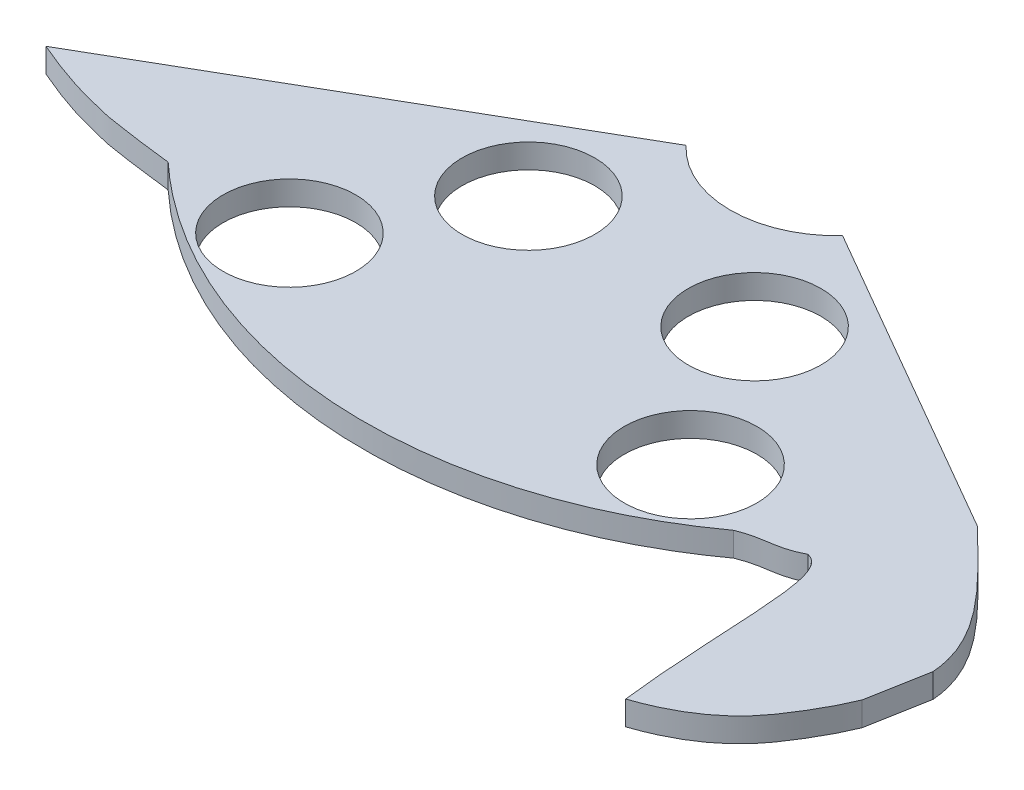
ISO-10303-21;
HEADER;
FILE_DESCRIPTION(('STEP AP214'),'2;1');
FILE_NAME('part.step','',(''),(''),'','','');
FILE_SCHEMA(('AUTOMOTIVE_DESIGN { 1 0 10303 214 1 1 1 1 }'));
ENDSEC;
DATA;
#1=APPLICATION_CONTEXT('core data for automotive mechanical design processes');
#2=APPLICATION_PROTOCOL_DEFINITION('international standard','automotive_design',2000,#1);
#3=PRODUCT_CONTEXT('',#1,'mechanical');
#4=PRODUCT('Part','Part','',(#3));
#5=PRODUCT_RELATED_PRODUCT_CATEGORY('part','',(#4));
#6=PRODUCT_DEFINITION_FORMATION('','',#4);
#7=PRODUCT_DEFINITION_CONTEXT('part definition',#1,'design');
#8=PRODUCT_DEFINITION('design','',#6,#7);
#9=PRODUCT_DEFINITION_SHAPE('','',#8);
#10=(LENGTH_UNIT() NAMED_UNIT(*) SI_UNIT(.MILLI.,.METRE.));
#11=(NAMED_UNIT(*) PLANE_ANGLE_UNIT() SI_UNIT($,.RADIAN.));
#12=(NAMED_UNIT(*) SI_UNIT($,.STERADIAN.) SOLID_ANGLE_UNIT());
#13=UNCERTAINTY_MEASURE_WITH_UNIT(LENGTH_MEASURE(1.E-05),#10,'distance_accuracy_value','');
#14=(GEOMETRIC_REPRESENTATION_CONTEXT(3) GLOBAL_UNCERTAINTY_ASSIGNED_CONTEXT((#13)) GLOBAL_UNIT_ASSIGNED_CONTEXT((#10,
#11,#12)) REPRESENTATION_CONTEXT('',''));
#15=CARTESIAN_POINT('',(0.,0.,0.));
#16=DIRECTION('',(0.,0.,1.));
#17=DIRECTION('',(1.,0.,0.));
#18=AXIS2_PLACEMENT_3D('',#15,#16,#17);
#19=CARTESIAN_POINT('',(-67.1542123865947,-31.7359999999999,55.3592407251619));
#20=DIRECTION('',(0.,-1.,0.));
#21=DIRECTION('',(0.,0.,-1.));
#22=AXIS2_PLACEMENT_3D('',#19,#20,#21);
#23=PLANE('',#22);
#24=CARTESIAN_POINT('',(18.75,-31.7359999999999,32.476));
#25=DIRECTION('',(0.,-1.,0.));
#26=DIRECTION('',(0.,0.,-1.));
#27=AXIS2_PLACEMENT_3D('',#24,#25,#26);
#28=CIRCLE('',#27,10.999845998306);
#29=CARTESIAN_POINT('',(18.75,-31.7359999999999,21.476154001694));
#30=VERTEX_POINT('',#29);
#31=EDGE_CURVE('E388',#30,#30,#28,.T.);
#32=ORIENTED_EDGE('',*,*,#31,.F.);
#33=EDGE_LOOP('',(#32));
#34=FACE_BOUND('',#33,.T.);
#35=CARTESIAN_POINT('',(-33.25,-31.7359999999999,57.591));
#36=DIRECTION('',(0.,-1.,0.));
#37=DIRECTION('',(0.,0.,-1.));
#38=AXIS2_PLACEMENT_3D('',#35,#36,#37);
#39=CIRCLE('',#38,10.999845998306);
#40=CARTESIAN_POINT('',(-33.25,-31.7359999999999,46.591154001694));
#41=VERTEX_POINT('',#40);
#42=EDGE_CURVE('E381',#41,#41,#39,.T.);
#43=ORIENTED_EDGE('',*,*,#42,.F.);
#44=EDGE_LOOP('',(#43));
#45=FACE_BOUND('',#44,.T.);
#46=DIRECTION('',(0.8660251781737,0.,-0.500000390769058));
#47=VECTOR('',#46,1.);
#48=CARTESIAN_POINT('',(-69.4472981971247,-31.7359999999999,44.7142726813082));
#49=LINE('',#48,#47);
#50=CARTESIAN_POINT('',(-80.2457627718106,-31.7359999999999,50.9487756070024));
#51=VERTEX_POINT('',#50);
#52=CARTESIAN_POINT('',(-69.4472981971247,-31.7359999999999,44.7142726813082));
#53=VERTEX_POINT('',#52);
#54=EDGE_CURVE('E375',#51,#53,#49,.T.);
#55=ORIENTED_EDGE('',*,*,#54,.T.);
#56=DIRECTION('',(0.866025120737022,0.,-0.500000490252186));
#57=VECTOR('',#56,1.);
#58=CARTESIAN_POINT('',(-69.4472981971247,-31.7359999999999,44.7142726813082));
#59=LINE('',#58,#57);
#60=CARTESIAN_POINT('',(-12.9766531358799,-31.7359999999999,12.1108879302399));
#61=VERTEX_POINT('',#60);
#62=EDGE_CURVE('E107',#53,#61,#59,.T.);
#63=ORIENTED_EDGE('',*,*,#62,.T.);
#64=CARTESIAN_POINT('',(0.,-31.7359999999999,0.));
#65=DIRECTION('',(0.,1.,0.));
#66=DIRECTION('',(0.,0.,-1.));
#67=AXIS2_PLACEMENT_3D('',#64,#65,#66);
#68=CIRCLE('',#67,17.7501305084715);
#69=CARTESIAN_POINT('',(12.9766531358511,-31.7359999999999,12.1108879302707));
#70=VERTEX_POINT('',#69);
#71=EDGE_CURVE('E374',#61,#70,#68,.T.);
#72=ORIENTED_EDGE('',*,*,#71,.T.);
#73=DIRECTION('',(0.866025113442762,0.,0.500000502886197));
#74=VECTOR('',#73,1.);
#75=CARTESIAN_POINT('',(12.9766531358511,-31.7359999999999,12.1108879302707));
#76=LINE('',#75,#74);
#77=CARTESIAN_POINT('',(65.8946490574716,-31.7359999999999,42.6631480920527));
#78=VERTEX_POINT('',#77);
#79=EDGE_CURVE('E336',#70,#78,#76,.T.);
#80=ORIENTED_EDGE('',*,*,#79,.T.);
#81=CARTESIAN_POINT('',(65.8946490574716,-31.7359999999999,42.6631480920527));
#82=CARTESIAN_POINT('',(75.4145416015002,-31.7359999999999,51.940049241931));
#83=CARTESIAN_POINT('',(82.3765856825695,-31.7359999999999,58.6162565448879));
#84=CARTESIAN_POINT('',(83.0502389135735,-31.7359999999999,67.164443807956));
#85=B_SPLINE_CURVE_WITH_KNOTS('',3,(#81,#82,#83,#84),.UNSPECIFIED.,.F.,.F.,(4,4),(0.,1.),.UNSPECIFIED.);
#86=CARTESIAN_POINT('',(83.0502389135735,-31.7359999999999,67.164443807956));
#87=VERTEX_POINT('',#86);
#88=EDGE_CURVE('E331',#78,#87,#85,.T.);
#89=ORIENTED_EDGE('',*,*,#88,.T.);
#90=DIRECTION('',(-0.178791975324779,0.,0.983886898764011));
#91=VECTOR('',#90,1.);
#92=CARTESIAN_POINT('',(83.0502389135735,-31.7359999999999,67.164443807956));
#93=LINE('',#92,#91);
#94=CARTESIAN_POINT('',(81.2370523152279,-31.7359999999999,77.1423554893168));
#95=VERTEX_POINT('',#94);
#96=EDGE_CURVE('E325',#87,#95,#93,.T.);
#97=ORIENTED_EDGE('',*,*,#96,.T.);
#98=CARTESIAN_POINT('',(81.2370523152279,-31.7359999999999,77.1423554893168));
#99=CARTESIAN_POINT('',(80.1426049600917,-31.7359999999999,79.8324304502769));
#100=CARTESIAN_POINT('',(78.5423570735947,-31.7359999999999,82.75217887059));
#101=CARTESIAN_POINT('',(72.9003380692606,-31.7359999999999,91.1400641734414));
#102=CARTESIAN_POINT('',(67.8354049075009,-31.7359999999999,94.4711963023661));
#103=CARTESIAN_POINT('',(61.5133899629736,-31.7359999999999,96.6041758783421));
#104=B_SPLINE_CURVE_WITH_KNOTS('',3,(#98,#99,#100,#101,#102,#103),.UNSPECIFIED.,.F.,.F.,(4,2,4),
(0.,0.384612078312348,0.999999759150881),.UNSPECIFIED.);
#105=CARTESIAN_POINT('',(61.5133899629736,-31.7359999999999,96.6041758783421));
#106=VERTEX_POINT('',#105);
#107=EDGE_CURVE('E300',#95,#106,#104,.T.);
#108=ORIENTED_EDGE('',*,*,#107,.T.);
#109=CARTESIAN_POINT('',(55.8371220766772,-31.7359999999999,60.7330896766971));
#110=CARTESIAN_POINT('',(55.9572182160026,-31.7359999999999,60.7648800494554));
#111=CARTESIAN_POINT('',(56.1943017513894,-31.7359999999999,60.8276321635437));
#112=CARTESIAN_POINT('',(56.5293050502606,-31.7359999999999,60.9764066754173));
#113=CARTESIAN_POINT('',(56.9147693621887,-31.7359999999999,61.2091894316015));
#114=CARTESIAN_POINT('',(57.3335774009859,-31.7359999999999,61.580320396772));
#115=CARTESIAN_POINT('',(57.7236265230981,-31.7359999999999,62.0925569273689));
#116=CARTESIAN_POINT('',(58.0469966018681,-31.7359999999999,62.6702768912015));
#117=CARTESIAN_POINT('',(58.3786369666738,-31.7359999999999,63.4379128847456));
#118=CARTESIAN_POINT('',(58.7065880437535,-31.7359999999999,64.4888894393945));
#119=CARTESIAN_POINT('',(58.9826843241353,-31.7359999999999,65.7379688878289));
#120=CARTESIAN_POINT('',(59.2021878443187,-31.7359999999999,67.0584993113356));
#121=CARTESIAN_POINT('',(59.4270079702606,-31.7359999999999,68.7827708547501));
#122=CARTESIAN_POINT('',(59.6334535892654,-31.7359999999999,70.9740502496213));
#123=CARTESIAN_POINT('',(59.8186124996113,-31.7359999999999,73.5770282216461));
#124=CARTESIAN_POINT('',(59.9731515281198,-31.7359999999999,76.1821796531466));
#125=CARTESIAN_POINT('',(60.1153992829083,-31.7359999999999,78.7881932546546));
#126=CARTESIAN_POINT('',(60.2576831241111,-31.7359999999999,81.3942346470838));
#127=CARTESIAN_POINT('',(60.4093902156785,-31.7359999999999,83.9996284084462));
#128=CARTESIAN_POINT('',(60.5783374993919,-31.7359999999999,86.6038073783577));
#129=CARTESIAN_POINT('',(60.7399818017884,-31.7359999999999,88.7778336367267));
#130=CARTESIAN_POINT('',(60.8846203081433,-31.7359999999999,90.5115337254225));
#131=CARTESIAN_POINT('',(60.9993907859476,-31.7359999999999,91.7903134549724));
#132=CARTESIAN_POINT('',(61.1192473828836,-31.7359999999999,93.0344520814384));
#133=CARTESIAN_POINT('',(61.244364540668,-31.7359999999999,94.2465798515415));
#134=CARTESIAN_POINT('',(61.3744804408622,-31.7359999999999,95.4340560329306));
#135=CARTESIAN_POINT('',(61.4674156600067,-31.7359999999999,96.2168626921242));
#136=CARTESIAN_POINT('',(61.5133975758836,-31.7359999999999,96.6041749745334));
#137=B_SPLINE_CURVE_WITH_KNOTS('',3,(#109,#110,#111,#112,#113,#114,#115,#116,#117,#118,#119,
#120,#121,#122,#123,#124,#125,#126,#127,#128,#129,#130,#131,#132,#133,#134,#135,#136),
.UNSPECIFIED.,.F.,.F.,(4,1,1,1,1,1,1,1,1,1,1,1,1,1,1,1,1,1,1,1,1,1,1,1,1,4),
(-4.32909310621454E-08,0.00999701545049358,0.0197351504627304,0.0294121944947161,
0.0461972685733814,0.0644513125890503,0.0810361385479351,0.0994350802182177,0.1317352470654,
0.169566844260307,0.202432758389494,0.239570155145605,0.309653847868401,0.379737117055157,
0.449830301367976,0.519929632423882,0.590029203337477,0.660124360472665,0.730213586731021,
0.800299621413169,0.83577595454087,0.870390717459047,0.903750589583447,0.936485572304299,
0.968576135196696,1.00000279982156),.UNSPECIFIED.);
#138=CARTESIAN_POINT('',(55.8371220766773,-31.7359999999999,60.7330896766971));
#139=VERTEX_POINT('',#138);
#140=EDGE_CURVE('E137',#106,#139,#137,.F.);
#141=ORIENTED_EDGE('',*,*,#140,.T.);
#142=CARTESIAN_POINT('',(46.2452118619303,-31.7359999999999,63.4316054794592));
#143=CARTESIAN_POINT('',(46.337826451566,-31.7359999999999,63.3951630130936));
#144=CARTESIAN_POINT('',(46.5107173798544,-31.7359999999999,63.3271329989904));
#145=CARTESIAN_POINT('',(46.8827590320524,-31.7359999999999,63.1876460598679));
#146=CARTESIAN_POINT('',(47.562852890933,-31.7359999999999,62.9506252183054));
#147=CARTESIAN_POINT('',(48.5799881653781,-31.7359999999999,62.6579392012386));
#148=CARTESIAN_POINT('',(49.6176269931826,-31.7359999999999,62.4469394700371));
#149=CARTESIAN_POINT('',(50.454675197474,-31.7359999999999,62.3104712330071));
#150=CARTESIAN_POINT('',(51.2943251992915,-31.7359999999999,62.1825648854283));
#151=CARTESIAN_POINT('',(52.3424577820839,-31.7359999999999,62.010683702123));
#152=CARTESIAN_POINT('',(53.5785540224912,-31.7359999999999,61.7028566985066));
#153=CARTESIAN_POINT('',(54.5743792876471,-31.7359999999999,61.3376946020341));
#154=CARTESIAN_POINT('',(55.231073633369,-31.7359999999999,61.0393961064838));
#155=CARTESIAN_POINT('',(55.5865600511412,-31.7359999999999,60.8639856570596));
#156=CARTESIAN_POINT('',(55.7504956465041,-31.7359999999999,60.7783451619097));
#157=CARTESIAN_POINT('',(55.8371220766232,-31.7359999999999,60.7330896765936));
#158=B_SPLINE_CURVE_WITH_KNOTS('',3,(#142,#143,#144,#145,#146,#147,#148,#149,#150,#151,#152,
#153,#154,#155,#156,#157),.UNSPECIFIED.,.F.,.F.,(4,1,1,1,1,1,1,1,1,1,1,1,1,4),
(3.39488733238635E-05,0.0298680043739559,0.0557275233998022,0.119134844750029,0.245729863665602,
0.372639773706773,0.436291383372757,0.499957120025951,0.627252648589094,0.754554880733438,
0.881180220072594,0.944558052759256,0.970703295687976,1.),.UNSPECIFIED.);
#159=CARTESIAN_POINT('',(46.2452118619303,-31.7359999999999,63.4316054794592));
#160=VERTEX_POINT('',#159);
#161=EDGE_CURVE('E129',#139,#160,#158,.F.);
#162=ORIENTED_EDGE('',*,*,#161,.T.);
#163=CARTESIAN_POINT('',(-53.4893401412044,-31.7359999999999,57.4553575450886));
#164=CARTESIAN_POINT('',(-50.1865786234929,-31.7359999999999,60.530633694826));
#165=CARTESIAN_POINT('',(-46.618572045229,-31.7359999999999,63.3191161806949));
#166=CARTESIAN_POINT('',(-39.0551084352809,-31.7359999999999,68.2446238295473));
#167=CARTESIAN_POINT('',(-35.0622169623532,-31.7359999999999,70.3790891958994));
#168=CARTESIAN_POINT('',(-26.763939823196,-31.7359999999999,73.9343458847786));
#169=CARTESIAN_POINT('',(-22.464450628197,-31.7359999999999,75.3523038004715));
#170=CARTESIAN_POINT('',(-13.6808684002517,-31.7359999999999,77.4297187386164));
#171=CARTESIAN_POINT('',(-9.20042271711571,-31.7359999999999,78.0890818901254));
#172=CARTESIAN_POINT('',(-0.190679327055086,-31.7359999999999,78.6285088587536));
#173=CARTESIAN_POINT('',(4.3369860359544,-31.7359999999999,78.5100669761452));
#174=CARTESIAN_POINT('',(13.3043442517594,-31.7359999999999,77.4954119685198));
#175=CARTESIAN_POINT('',(17.7449792987534,-31.7359999999999,76.6011212963634));
#176=CARTESIAN_POINT('',(26.4064634267764,-31.7359999999999,74.0631253553625));
#177=CARTESIAN_POINT('',(30.6270131277086,-31.7359999999999,72.4210723936952));
#178=CARTESIAN_POINT('',(36.6980942739425,-31.7359999999999,69.4299810562971));
#179=CARTESIAN_POINT('',(38.6809192993778,-31.7359999999999,68.3446979598656));
#180=CARTESIAN_POINT('',(42.543443096176,-31.7359999999999,66.010786965088));
#181=CARTESIAN_POINT('',(44.422079014527,-31.7359999999999,64.7613382842975));
#182=CARTESIAN_POINT('',(46.2452118618439,-31.7359999999999,63.4316054793408));
#183=B_SPLINE_CURVE_WITH_KNOTS('',3,(#163,#164,#165,#166,#167,#168,#169,#170,#171,#172,#173,
#174,#175,#176,#177,#178,#179,#180,#181,#182),.UNSPECIFIED.,.F.,.F.,(4,2,2,2,2,2,2,2,2,4),
(1.74061715230156E-06,0.125000987959647,0.250000987959647,0.375000987959647,0.500000987959647,
0.625000987959647,0.750000987959647,0.875000987959647,0.937500987959647,0.999999247342494),.UNSPECIFIED.);
#184=CARTESIAN_POINT('',(-53.4893401412041,-31.7359999999999,57.4553575450889));
#185=VERTEX_POINT('',#184);
#186=EDGE_CURVE('E134',#160,#185,#183,.F.);
#187=ORIENTED_EDGE('',*,*,#186,.T.);
#188=CARTESIAN_POINT('',(-80.2457627718106,-31.7359999999999,50.9487756070024));
#189=CARTESIAN_POINT('',(-79.9710240449724,-31.7359999999999,51.0675176149174));
#190=CARTESIAN_POINT('',(-79.4163281074057,-31.7359999999999,51.3072570581586));
#191=CARTESIAN_POINT('',(-78.2013274676912,-31.7359999999999,51.8157264794908));
#192=CARTESIAN_POINT('',(-76.424640425333,-31.7359999999999,52.5270811036941));
#193=CARTESIAN_POINT('',(-74.164307694632,-31.7359999999999,53.363768474054));
#194=CARTESIAN_POINT('',(-72.1397013701143,-31.7359999999999,54.0344762002689));
#195=CARTESIAN_POINT('',(-70.6019761674887,-31.7359999999999,54.4815865255904));
#196=CARTESIAN_POINT('',(-69.4414572478317,-31.7359999999999,54.7873275160044));
#197=CARTESIAN_POINT('',(-68.3106352193613,-31.7359999999999,55.0670554545509));
#198=CARTESIAN_POINT('',(-67.3407336861109,-31.7359999999999,55.3106235754107));
#199=CARTESIAN_POINT('',(-66.5661235840869,-31.7359999999999,55.5105766290934));
#200=CARTESIAN_POINT('',(-65.9849002576492,-31.7359999999999,55.6598360584587));
#201=CARTESIAN_POINT('',(-65.4001768571308,-31.7359999999999,55.7976384683275));
#202=CARTESIAN_POINT('',(-64.8087805357869,-31.7359999999999,55.9091609300685));
#203=CARTESIAN_POINT('',(-64.2132773856928,-31.7359999999999,56.0026572003222));
#204=CARTESIAN_POINT('',(-63.417418240987,-31.7359999999999,56.1216288809392));
#205=CARTESIAN_POINT('',(-62.4227200921819,-31.7359999999999,56.2721850298928));
#206=CARTESIAN_POINT('',(-61.2297291551601,-31.7359999999999,56.4577985633297));
#207=CARTESIAN_POINT('',(-60.0351186775312,-31.7359999999999,56.6371572699833));
#208=CARTESIAN_POINT('',(-58.8371149091859,-31.7359999999999,56.8027287863694));
#209=CARTESIAN_POINT('',(-57.6355479253561,-31.7359999999999,56.9523600335831));
#210=CARTESIAN_POINT('',(-56.4322694436166,-31.7359999999999,57.0957628206297));
#211=CARTESIAN_POINT('',(-55.3156468785094,-31.7359999999999,57.2289038536631));
#212=CARTESIAN_POINT('',(-54.3346428117277,-31.7359999999999,57.3486366881149));
#213=CARTESIAN_POINT('',(-53.7550150032177,-31.7359999999999,57.421815655374));
#214=CARTESIAN_POINT('',(-53.4893401412043,-31.7359999999999,57.455357545089));
#215=B_SPLINE_CURVE_WITH_KNOTS('',3,(#188,#189,#190,#191,#192,#193,#194,#195,#196,#197,#198,
#199,#200,#201,#202,#203,#204,#205,#206,#207,#208,#209,#210,#211,#212,#213,#214),.UNSPECIFIED.,
.F.,.F.,(4,1,1,1,1,1,1,1,1,1,1,1,1,1,1,1,1,1,1,1,1,1,1,1,4),(0.,0.0324496499891075,
0.0655156600293397,0.142796548847021,0.239924982281343,0.326787352355294,0.373965278379878,
0.413525211675801,0.456894269351231,0.500262539435267,0.52194540448629,0.543629130729834,
0.565323701920074,0.587063048052444,0.608858021916453,0.630675937975899,0.67430843436511,
0.717929982537018,0.761574952728187,0.805276979087721,0.849046649735792,0.892851591200768,
0.936658553136211,0.970967179441354,1.),.UNSPECIFIED.);
#216=EDGE_CURVE('E51',#185,#51,#215,.F.);
#217=ORIENTED_EDGE('',*,*,#216,.T.);
#218=EDGE_LOOP('',(#55,#63,#72,#80,#89,#97,#108,#141,#162,#187,#217));
#219=FACE_BOUND('',#218,.T.);
#220=CARTESIAN_POINT('',(33.25,-31.7359999999999,57.591));
#221=DIRECTION('',(0.,-1.,0.));
#222=DIRECTION('',(0.,0.,-1.));
#223=AXIS2_PLACEMENT_3D('',#220,#221,#222);
#224=CIRCLE('',#223,10.999845998306);
#225=CARTESIAN_POINT('',(33.25,-31.7359999999999,46.591154001694));
#226=VERTEX_POINT('',#225);
#227=EDGE_CURVE('E382',#226,#226,#224,.T.);
#228=ORIENTED_EDGE('',*,*,#227,.F.);
#229=EDGE_LOOP('',(#228));
#230=FACE_BOUND('',#229,.T.);
#231=CARTESIAN_POINT('',(-18.75,-31.7359999999999,32.476));
#232=DIRECTION('',(0.,-1.,0.));
#233=DIRECTION('',(0.,0.,-1.));
#234=AXIS2_PLACEMENT_3D('',#231,#232,#233);
#235=CIRCLE('',#234,10.999845998306);
#236=CARTESIAN_POINT('',(-18.75,-31.7359999999999,21.476154001694));
#237=VERTEX_POINT('',#236);
#238=EDGE_CURVE('E394',#237,#237,#235,.T.);
#239=ORIENTED_EDGE('',*,*,#238,.F.);
#240=EDGE_LOOP('',(#239));
#241=FACE_BOUND('',#240,.T.);
#242=ADVANCED_FACE('F30',(#34,#45,#219,#230,#241),#23,.T.);
#243=CARTESIAN_POINT('',(-67.1542123865947,-27.7359999999999,55.3592407251619));
#244=DIRECTION('',(0.,-1.,0.));
#245=DIRECTION('',(0.,0.,-1.));
#246=AXIS2_PLACEMENT_3D('',#243,#244,#245);
#247=PLANE('',#246);
#248=CARTESIAN_POINT('',(18.75,-27.7359999999999,32.476));
#249=DIRECTION('',(0.,-1.,0.));
#250=DIRECTION('',(0.,0.,-1.));
#251=AXIS2_PLACEMENT_3D('',#248,#249,#250);
#252=CIRCLE('',#251,10.999845998306);
#253=CARTESIAN_POINT('',(18.75,-27.7359999999999,21.476154001694));
#254=VERTEX_POINT('',#253);
#255=EDGE_CURVE('E391',#254,#254,#252,.T.);
#256=ORIENTED_EDGE('',*,*,#255,.T.);
#257=EDGE_LOOP('',(#256));
#258=FACE_BOUND('',#257,.T.);
#259=CARTESIAN_POINT('',(-33.25,-27.7359999999999,57.591));
#260=DIRECTION('',(0.,-1.,0.));
#261=DIRECTION('',(0.,0.,-1.));
#262=AXIS2_PLACEMENT_3D('',#259,#260,#261);
#263=CIRCLE('',#262,10.999845998306);
#264=CARTESIAN_POINT('',(-33.25,-27.7359999999999,46.591154001694));
#265=VERTEX_POINT('',#264);
#266=EDGE_CURVE('E378',#265,#265,#263,.T.);
#267=ORIENTED_EDGE('',*,*,#266,.T.);
#268=EDGE_LOOP('',(#267));
#269=FACE_BOUND('',#268,.T.);
#270=DIRECTION('',(0.8660251781737,0.,-0.500000390769058));
#271=VECTOR('',#270,1.);
#272=CARTESIAN_POINT('',(-69.4472981971247,-27.7359999999999,44.7142726813082));
#273=LINE('',#272,#271);
#274=CARTESIAN_POINT('',(-80.2457627718106,-27.7359999999999,50.9487756070024));
#275=VERTEX_POINT('',#274);
#276=CARTESIAN_POINT('',(-69.4472981971247,-27.7359999999999,44.7142726813082));
#277=VERTEX_POINT('',#276);
#278=EDGE_CURVE('E202',#275,#277,#273,.T.);
#279=ORIENTED_EDGE('',*,*,#278,.F.);
#280=CARTESIAN_POINT('',(-53.4893401412043,-27.7359999999999,57.455357545089));
#281=CARTESIAN_POINT('',(-53.7550150032177,-27.7359999999999,57.421815655374));
#282=CARTESIAN_POINT('',(-54.3346428117277,-27.7359999999999,57.3486366881149));
#283=CARTESIAN_POINT('',(-55.3156468785094,-27.7359999999999,57.2289038536631));
#284=CARTESIAN_POINT('',(-56.4322694436166,-27.7359999999999,57.0957628206297));
#285=CARTESIAN_POINT('',(-57.6355479253561,-27.7359999999999,56.9523600335831));
#286=CARTESIAN_POINT('',(-58.8371149091859,-27.7359999999999,56.8027287863694));
#287=CARTESIAN_POINT('',(-60.0351186775312,-27.7359999999999,56.6371572699833));
#288=CARTESIAN_POINT('',(-61.2297291551601,-27.7359999999999,56.4577985633297));
#289=CARTESIAN_POINT('',(-62.4227200921819,-27.7359999999999,56.2721850298928));
#290=CARTESIAN_POINT('',(-63.417418240987,-27.7359999999999,56.1216288809392));
#291=CARTESIAN_POINT('',(-64.2132773856928,-27.7359999999999,56.0026572003222));
#292=CARTESIAN_POINT('',(-64.8087805357869,-27.7359999999999,55.9091609300685));
#293=CARTESIAN_POINT('',(-65.4001768571308,-27.7359999999999,55.7976384683275));
#294=CARTESIAN_POINT('',(-65.9849002576492,-27.7359999999999,55.6598360584587));
#295=CARTESIAN_POINT('',(-66.5661235840869,-27.7359999999999,55.5105766290934));
#296=CARTESIAN_POINT('',(-67.3407336861109,-27.7359999999999,55.3106235754107));
#297=CARTESIAN_POINT('',(-68.3106352193613,-27.7359999999999,55.0670554545509));
#298=CARTESIAN_POINT('',(-69.4414572478317,-27.7359999999999,54.7873275160044));
#299=CARTESIAN_POINT('',(-70.6019761674887,-27.7359999999999,54.4815865255904));
#300=CARTESIAN_POINT('',(-72.1397013701143,-27.7359999999999,54.0344762002689));
#301=CARTESIAN_POINT('',(-74.164307694632,-27.7359999999999,53.363768474054));
#302=CARTESIAN_POINT('',(-76.424640425333,-27.7359999999999,52.5270811036941));
#303=CARTESIAN_POINT('',(-78.2013274676912,-27.7359999999999,51.8157264794908));
#304=CARTESIAN_POINT('',(-79.4163281074057,-27.7359999999999,51.3072570581586));
#305=CARTESIAN_POINT('',(-79.9710240449724,-27.7359999999999,51.0675176149174));
#306=CARTESIAN_POINT('',(-80.2457627718106,-27.7359999999999,50.9487756070024));
#307=B_SPLINE_CURVE_WITH_KNOTS('',3,(#280,#281,#282,#283,#284,#285,#286,#287,#288,#289,#290,
#291,#292,#293,#294,#295,#296,#297,#298,#299,#300,#301,#302,#303,#304,#305,#306),.UNSPECIFIED.,
.F.,.F.,(4,1,1,1,1,1,1,1,1,1,1,1,1,1,1,1,1,1,1,1,1,1,1,1,4),(0.,0.0290328205586459,
0.063341446863789,0.107148408799232,0.150953350264208,0.194723020912279,0.238425047271813,
0.282070017462982,0.32569156563489,0.369324062024101,0.391141978083548,0.412936951947556,
0.434676298079926,0.456370869270166,0.47805459551371,0.499737460564733,0.543105730648769,
0.586474788324199,0.626034721620122,0.673212647644706,0.760075017718657,0.857203451152979,
0.93448433997066,0.967550350010893,1.),.UNSPECIFIED.);
#308=CARTESIAN_POINT('',(-53.4893401412041,-27.7359999999999,57.4553575450889));
#309=VERTEX_POINT('',#308);
#310=EDGE_CURVE('E97',#309,#275,#307,.T.);
#311=ORIENTED_EDGE('',*,*,#310,.F.);
#312=CARTESIAN_POINT('',(46.2452118618439,-27.7359999999999,63.4316054793408));
#313=CARTESIAN_POINT('',(44.422079014527,-27.7359999999999,64.7613382842975));
#314=CARTESIAN_POINT('',(42.543443096176,-27.7359999999999,66.010786965088));
#315=CARTESIAN_POINT('',(38.6809192993778,-27.7359999999999,68.3446979598656));
#316=CARTESIAN_POINT('',(36.6980942739425,-27.7359999999999,69.4299810562971));
#317=CARTESIAN_POINT('',(30.6270131277086,-27.7359999999999,72.4210723936952));
#318=CARTESIAN_POINT('',(26.4064634267764,-27.7359999999999,74.0631253553625));
#319=CARTESIAN_POINT('',(17.7449792987534,-27.7359999999999,76.6011212963634));
#320=CARTESIAN_POINT('',(13.3043442517594,-27.7359999999999,77.4954119685198));
#321=CARTESIAN_POINT('',(4.3369860359544,-27.7359999999999,78.5100669761452));
#322=CARTESIAN_POINT('',(-0.190679327055086,-27.7359999999999,78.6285088587536));
#323=CARTESIAN_POINT('',(-9.20042271711571,-27.7359999999999,78.0890818901254));
#324=CARTESIAN_POINT('',(-13.6808684002517,-27.7359999999999,77.4297187386164));
#325=CARTESIAN_POINT('',(-22.464450628197,-27.7359999999999,75.3523038004715));
#326=CARTESIAN_POINT('',(-26.763939823196,-27.7359999999999,73.9343458847786));
#327=CARTESIAN_POINT('',(-35.0622169623532,-27.7359999999999,70.3790891958994));
#328=CARTESIAN_POINT('',(-39.0551084352809,-27.7359999999999,68.2446238295473));
#329=CARTESIAN_POINT('',(-46.618572045229,-27.7359999999999,63.3191161806949));
#330=CARTESIAN_POINT('',(-50.1865786234929,-27.7359999999999,60.530633694826));
#331=CARTESIAN_POINT('',(-53.4893401412044,-27.7359999999999,57.4553575450886));
#332=B_SPLINE_CURVE_WITH_KNOTS('',3,(#312,#313,#314,#315,#316,#317,#318,#319,#320,#321,#322,
#323,#324,#325,#326,#327,#328,#329,#330,#331),.UNSPECIFIED.,.F.,.F.,(4,2,2,2,2,2,2,2,2,4),
(1.74061715227199E-06,0.0624999999999999,0.125,0.25,0.375,0.5,0.625,0.75,0.875,
0.999999247342494),.UNSPECIFIED.);
#333=CARTESIAN_POINT('',(46.2452118619303,-27.7359999999999,63.4316054794592));
#334=VERTEX_POINT('',#333);
#335=EDGE_CURVE('E90',#334,#309,#332,.T.);
#336=ORIENTED_EDGE('',*,*,#335,.F.);
#337=CARTESIAN_POINT('',(55.8371220766232,-27.7359999999999,60.7330896765936));
#338=CARTESIAN_POINT('',(55.7504956465041,-27.7359999999999,60.7783451619097));
#339=CARTESIAN_POINT('',(55.5865600511412,-27.7359999999999,60.8639856570596));
#340=CARTESIAN_POINT('',(55.231073633369,-27.7359999999999,61.0393961064838));
#341=CARTESIAN_POINT('',(54.5743792876471,-27.7359999999999,61.3376946020341));
#342=CARTESIAN_POINT('',(53.5785540224912,-27.7359999999999,61.7028566985066));
#343=CARTESIAN_POINT('',(52.3424577820839,-27.7359999999999,62.010683702123));
#344=CARTESIAN_POINT('',(51.2943251992915,-27.7359999999999,62.1825648854283));
#345=CARTESIAN_POINT('',(50.454675197474,-27.7359999999999,62.3104712330071));
#346=CARTESIAN_POINT('',(49.6176269931826,-27.7359999999999,62.4469394700371));
#347=CARTESIAN_POINT('',(48.5799881653781,-27.7359999999999,62.6579392012386));
#348=CARTESIAN_POINT('',(47.562852890933,-27.7359999999999,62.9506252183054));
#349=CARTESIAN_POINT('',(46.8827590320524,-27.7359999999999,63.1876460598679));
#350=CARTESIAN_POINT('',(46.5107173798544,-27.7359999999999,63.3271329989904));
#351=CARTESIAN_POINT('',(46.337826451566,-27.7359999999999,63.3951630130936));
#352=CARTESIAN_POINT('',(46.2452118619303,-27.7359999999999,63.4316054794592));
#353=B_SPLINE_CURVE_WITH_KNOTS('',3,(#337,#338,#339,#340,#341,#342,#343,#344,#345,#346,#347,
#348,#349,#350,#351,#352),.UNSPECIFIED.,.F.,.F.,(4,1,1,1,1,1,1,1,1,1,1,1,1,4),
(3.39488733238026E-05,0.0293306531853482,0.0554758961140681,0.11885372880073,0.245479068139886,
0.37278130028423,0.500076828847373,0.563742565500567,0.627394175166551,0.754304085207722,
0.880899104123295,0.944306425473522,0.970165944499368,1.),.UNSPECIFIED.);
#354=CARTESIAN_POINT('',(55.8371220766773,-27.7359999999999,60.7330896766971));
#355=VERTEX_POINT('',#354);
#356=EDGE_CURVE('E148',#355,#334,#353,.T.);
#357=ORIENTED_EDGE('',*,*,#356,.F.);
#358=CARTESIAN_POINT('',(61.5133975758836,-27.7359999999999,96.6041749745334));
#359=CARTESIAN_POINT('',(61.4674156600067,-27.7359999999999,96.2168626921242));
#360=CARTESIAN_POINT('',(61.3744804408622,-27.7359999999999,95.4340560329306));
#361=CARTESIAN_POINT('',(61.244364540668,-27.7359999999999,94.2465798515415));
#362=CARTESIAN_POINT('',(61.1192473828836,-27.7359999999999,93.0344520814384));
#363=CARTESIAN_POINT('',(60.9993907859476,-27.7359999999999,91.7903134549724));
#364=CARTESIAN_POINT('',(60.8846203081433,-27.7359999999999,90.5115337254225));
#365=CARTESIAN_POINT('',(60.7399818017884,-27.7359999999999,88.7778336367267));
#366=CARTESIAN_POINT('',(60.5783374993919,-27.7359999999999,86.6038073783577));
#367=CARTESIAN_POINT('',(60.4093902156785,-27.7359999999999,83.9996284084462));
#368=CARTESIAN_POINT('',(60.2576831241111,-27.7359999999999,81.3942346470838));
#369=CARTESIAN_POINT('',(60.1153992829083,-27.7359999999999,78.7881932546546));
#370=CARTESIAN_POINT('',(59.9731515281198,-27.7359999999999,76.1821796531466));
#371=CARTESIAN_POINT('',(59.8186124996113,-27.7359999999999,73.5770282216461));
#372=CARTESIAN_POINT('',(59.6334535892654,-27.7359999999999,70.9740502496213));
#373=CARTESIAN_POINT('',(59.4270079702606,-27.7359999999999,68.7827708547501));
#374=CARTESIAN_POINT('',(59.2021878443187,-27.7359999999999,67.0584993113356));
#375=CARTESIAN_POINT('',(58.9826843241353,-27.7359999999999,65.7379688878289));
#376=CARTESIAN_POINT('',(58.7065880437535,-27.7359999999999,64.4888894393945));
#377=CARTESIAN_POINT('',(58.3786369666738,-27.7359999999999,63.4379128847456));
#378=CARTESIAN_POINT('',(58.0469966018681,-27.7359999999999,62.6702768912015));
#379=CARTESIAN_POINT('',(57.7236265230981,-27.7359999999999,62.0925569273689));
#380=CARTESIAN_POINT('',(57.3335774009859,-27.7359999999999,61.580320396772));
#381=CARTESIAN_POINT('',(56.9147693621887,-27.7359999999999,61.2091894316015));
#382=CARTESIAN_POINT('',(56.5293050502606,-27.7359999999999,60.9764066754173));
#383=CARTESIAN_POINT('',(56.1943017513894,-27.7359999999999,60.8276321635437));
#384=CARTESIAN_POINT('',(55.9572182160026,-27.7359999999999,60.7648800494554));
#385=CARTESIAN_POINT('',(55.8371220766772,-27.7359999999999,60.7330896766971));
#386=B_SPLINE_CURVE_WITH_KNOTS('',3,(#358,#359,#360,#361,#362,#363,#364,#365,#366,#367,#368,
#369,#370,#371,#372,#373,#374,#375,#376,#377,#378,#379,#380,#381,#382,#383,#384,#385),
.UNSPECIFIED.,.F.,.F.,(4,1,1,1,1,1,1,1,1,1,1,1,1,1,1,1,1,1,1,1,1,1,1,1,1,4),
(-4.32909309719428E-08,0.0314266213339294,0.063517184226326,0.0962521669471788,
0.129612039071579,0.164226801989756,0.199703135117456,0.269789169799604,0.339878396057961,
0.409973553193149,0.480073124106743,0.55017245516265,0.620265639475468,0.690348908662224,
0.76043260138502,0.797569998141131,0.830435912270318,0.868267509465225,0.900567676312408,
0.91896661798269,0.935551443941575,0.953805487957244,0.970590562035909,0.980267606067895,
0.990005741080132,1.00000279982156),.UNSPECIFIED.);
#387=CARTESIAN_POINT('',(61.5133899629736,-27.7359999999999,96.6041758783421));
#388=VERTEX_POINT('',#387);
#389=EDGE_CURVE('E531',#388,#355,#386,.T.);
#390=ORIENTED_EDGE('',*,*,#389,.F.);
#391=CARTESIAN_POINT('',(81.2370523152279,-27.7359999999999,77.1423554893168));
#392=CARTESIAN_POINT('',(80.1426049600917,-27.7359999999999,79.8324304502769));
#393=CARTESIAN_POINT('',(78.5423570735947,-27.7359999999999,82.75217887059));
#394=CARTESIAN_POINT('',(72.9003380692606,-27.7359999999999,91.1400641734414));
#395=CARTESIAN_POINT('',(67.8354049075009,-27.7359999999999,94.4711963023661));
#396=CARTESIAN_POINT('',(61.5133899629736,-27.7359999999999,96.6041758783421));
#397=B_SPLINE_CURVE_WITH_KNOTS('',3,(#391,#392,#393,#394,#395,#396),.UNSPECIFIED.,.F.,.F.,(4,2,
4),(0.,0.384612078312348,0.999999759150881),.UNSPECIFIED.);
#398=CARTESIAN_POINT('',(81.2370523152279,-27.7359999999999,77.1423554893168));
#399=VERTEX_POINT('',#398);
#400=EDGE_CURVE('E215',#399,#388,#397,.T.);
#401=ORIENTED_EDGE('',*,*,#400,.F.);
#402=DIRECTION('',(-0.178791975324779,0.,0.983886898764011));
#403=VECTOR('',#402,1.);
#404=CARTESIAN_POINT('',(83.0502389135735,-27.7359999999999,67.164443807956));
#405=LINE('',#404,#403);
#406=CARTESIAN_POINT('',(83.0502389135735,-27.7359999999999,67.164443807956));
#407=VERTEX_POINT('',#406);
#408=EDGE_CURVE('E210',#407,#399,#405,.T.);
#409=ORIENTED_EDGE('',*,*,#408,.F.);
#410=CARTESIAN_POINT('',(65.8946490574716,-27.7359999999999,42.6631480920527));
#411=CARTESIAN_POINT('',(75.4145416015002,-27.7359999999999,51.940049241931));
#412=CARTESIAN_POINT('',(82.3765856825695,-27.7359999999999,58.6162565448879));
#413=CARTESIAN_POINT('',(83.0502389135735,-27.7359999999999,67.164443807956));
#414=B_SPLINE_CURVE_WITH_KNOTS('',3,(#410,#411,#412,#413),.UNSPECIFIED.,.F.,.F.,(4,4),(0.,1.),.UNSPECIFIED.);
#415=CARTESIAN_POINT('',(65.8946490574716,-27.7359999999999,42.6631480920527));
#416=VERTEX_POINT('',#415);
#417=EDGE_CURVE('E206',#416,#407,#414,.T.);
#418=ORIENTED_EDGE('',*,*,#417,.F.);
#419=DIRECTION('',(0.866025113442762,0.,0.500000502886197));
#420=VECTOR('',#419,1.);
#421=CARTESIAN_POINT('',(12.9766531358511,-27.7359999999999,12.1108879302707));
#422=LINE('',#421,#420);
#423=CARTESIAN_POINT('',(12.9766531358511,-27.7359999999999,12.1108879302707));
#424=VERTEX_POINT('',#423);
#425=EDGE_CURVE('E204',#424,#416,#422,.T.);
#426=ORIENTED_EDGE('',*,*,#425,.F.);
#427=CARTESIAN_POINT('',(0.,-27.7359999999999,0.));
#428=DIRECTION('',(0.,1.,0.));
#429=DIRECTION('',(0.,0.,-1.));
#430=AXIS2_PLACEMENT_3D('',#427,#428,#429);
#431=CIRCLE('',#430,17.7501305084715);
#432=CARTESIAN_POINT('',(-12.9766531358799,-27.7359999999999,12.1108879302399));
#433=VERTEX_POINT('',#432);
#434=EDGE_CURVE('E201',#433,#424,#431,.T.);
#435=ORIENTED_EDGE('',*,*,#434,.F.);
#436=DIRECTION('',(0.866025120737022,0.,-0.500000490252186));
#437=VECTOR('',#436,1.);
#438=CARTESIAN_POINT('',(-69.4472981971247,-27.7359999999999,44.7142726813082));
#439=LINE('',#438,#437);
#440=EDGE_CURVE('E196',#277,#433,#439,.T.);
#441=ORIENTED_EDGE('',*,*,#440,.F.);
#442=EDGE_LOOP('',(#279,#311,#336,#357,#390,#401,#409,#418,#426,#435,#441));
#443=FACE_BOUND('',#442,.T.);
#444=CARTESIAN_POINT('',(33.25,-27.7359999999999,57.591));
#445=DIRECTION('',(0.,-1.,0.));
#446=DIRECTION('',(0.,0.,-1.));
#447=AXIS2_PLACEMENT_3D('',#444,#445,#446);
#448=CIRCLE('',#447,10.999845998306);
#449=CARTESIAN_POINT('',(33.25,-27.7359999999999,46.591154001694));
#450=VERTEX_POINT('',#449);
#451=EDGE_CURVE('E385',#450,#450,#448,.T.);
#452=ORIENTED_EDGE('',*,*,#451,.T.);
#453=EDGE_LOOP('',(#452));
#454=FACE_BOUND('',#453,.T.);
#455=CARTESIAN_POINT('',(-18.75,-27.7359999999999,32.476));
#456=DIRECTION('',(0.,-1.,0.));
#457=DIRECTION('',(0.,0.,-1.));
#458=AXIS2_PLACEMENT_3D('',#455,#456,#457);
#459=CIRCLE('',#458,10.999845998306);
#460=CARTESIAN_POINT('',(-18.75,-27.7359999999999,21.476154001694));
#461=VERTEX_POINT('',#460);
#462=EDGE_CURVE('E397',#461,#461,#459,.T.);
#463=ORIENTED_EDGE('',*,*,#462,.T.);
#464=EDGE_LOOP('',(#463));
#465=FACE_BOUND('',#464,.T.);
#466=ADVANCED_FACE('F240',(#258,#269,#443,#454,#465),#247,.F.);
#467=CARTESIAN_POINT('',(-69.4472981971247,-31.7359999999999,44.7142726813082));
#468=DIRECTION('',(0.500000490252186,0.,0.866025120737022));
#469=DIRECTION('',(0.866025120737022,0.,-0.500000490252186));
#470=AXIS2_PLACEMENT_3D('',#467,#468,#469);
#471=PLANE('',#470);
#472=ORIENTED_EDGE('',*,*,#440,.T.);
#473=DIRECTION('',(0.,1.,0.));
#474=VECTOR('',#473,1.);
#475=CARTESIAN_POINT('',(-12.9766531358799,-31.7359999999999,12.1108879302399));
#476=LINE('',#475,#474);
#477=EDGE_CURVE('E11',#61,#433,#476,.T.);
#478=ORIENTED_EDGE('',*,*,#477,.F.);
#479=ORIENTED_EDGE('',*,*,#62,.F.);
#480=ORIENTED_EDGE('',*,*,#54,.F.);
#481=DIRECTION('',(0.,1.,0.));
#482=VECTOR('',#481,1.);
#483=CARTESIAN_POINT('',(-80.2457627718106,-31.7359999999999,50.9487756070024));
#484=LINE('',#483,#482);
#485=EDGE_CURVE('E579',#51,#275,#484,.T.);
#486=ORIENTED_EDGE('',*,*,#485,.T.);
#487=ORIENTED_EDGE('',*,*,#278,.T.);
#488=EDGE_LOOP('',(#472,#478,#479,#480,#486,#487));
#489=FACE_BOUND('',#488,.T.);
#490=ADVANCED_FACE('F32',(#489),#471,.F.);
#491=CARTESIAN_POINT('',(0.,-31.7359999999999,0.));
#492=DIRECTION('',(0.,1.,0.));
#493=DIRECTION('',(0.,0.,1.));
#494=AXIS2_PLACEMENT_3D('',#491,#492,#493);
#495=CYLINDRICAL_SURFACE('',#494,17.7501305084715);
#496=ORIENTED_EDGE('',*,*,#434,.T.);
#497=DIRECTION('',(0.,1.,0.));
#498=VECTOR('',#497,1.);
#499=CARTESIAN_POINT('',(12.9766531358511,-31.7359999999999,12.1108879302707));
#500=LINE('',#499,#498);
#501=EDGE_CURVE('E42',#70,#424,#500,.T.);
#502=ORIENTED_EDGE('',*,*,#501,.F.);
#503=ORIENTED_EDGE('',*,*,#71,.F.);
#504=ORIENTED_EDGE('',*,*,#477,.T.);
#505=EDGE_LOOP('',(#496,#502,#503,#504));
#506=FACE_BOUND('',#505,.T.);
#507=ADVANCED_FACE('F349',(#506),#495,.F.);
#508=CARTESIAN_POINT('',(12.9766531358511,-31.7359999999999,12.1108879302707));
#509=DIRECTION('',(-0.500000502886198,0.,0.866025113442763));
#510=DIRECTION('',(0.866025113442762,0.,0.500000502886197));
#511=AXIS2_PLACEMENT_3D('',#508,#509,#510);
#512=PLANE('',#511);
#513=ORIENTED_EDGE('',*,*,#425,.T.);
#514=DIRECTION('',(0.,1.,0.));
#515=VECTOR('',#514,1.);
#516=CARTESIAN_POINT('',(65.8946490574716,-31.7359999999999,42.6631480920527));
#517=LINE('',#516,#515);
#518=EDGE_CURVE('E223',#78,#416,#517,.T.);
#519=ORIENTED_EDGE('',*,*,#518,.F.);
#520=ORIENTED_EDGE('',*,*,#79,.F.);
#521=ORIENTED_EDGE('',*,*,#501,.T.);
#522=EDGE_LOOP('',(#513,#519,#520,#521));
#523=FACE_BOUND('',#522,.T.);
#524=ADVANCED_FACE('F346',(#523),#512,.F.);
#525=DIRECTION('',(0.,1.,0.));
#526=VECTOR('',#525,1.);
#527=SURFACE_OF_LINEAR_EXTRUSION('',#85,#526);
#528=ORIENTED_EDGE('',*,*,#417,.T.);
#529=DIRECTION('',(0.,1.,0.));
#530=VECTOR('',#529,1.);
#531=CARTESIAN_POINT('',(83.0502389135735,-31.7359999999999,67.164443807956));
#532=LINE('',#531,#530);
#533=EDGE_CURVE('E219',#87,#407,#532,.T.);
#534=ORIENTED_EDGE('',*,*,#533,.F.);
#535=ORIENTED_EDGE('',*,*,#88,.F.);
#536=ORIENTED_EDGE('',*,*,#518,.T.);
#537=EDGE_LOOP('',(#528,#534,#535,#536));
#538=FACE_BOUND('',#537,.T.);
#539=ADVANCED_FACE('F342',(#538),#527,.F.);
#540=CARTESIAN_POINT('',(83.0502389135735,-31.7359999999999,67.164443807956));
#541=DIRECTION('',(-0.983886898764011,0.,-0.178791975324779));
#542=DIRECTION('',(-0.178791975324779,0.,0.983886898764011));
#543=AXIS2_PLACEMENT_3D('',#540,#541,#542);
#544=PLANE('',#543);
#545=ORIENTED_EDGE('',*,*,#408,.T.);
#546=DIRECTION('',(0.,1.,0.));
#547=VECTOR('',#546,1.);
#548=CARTESIAN_POINT('',(81.2370523152279,-31.7359999999999,77.1423554893168));
#549=LINE('',#548,#547);
#550=EDGE_CURVE('E216',#95,#399,#549,.T.);
#551=ORIENTED_EDGE('',*,*,#550,.F.);
#552=ORIENTED_EDGE('',*,*,#96,.F.);
#553=ORIENTED_EDGE('',*,*,#533,.T.);
#554=EDGE_LOOP('',(#545,#551,#552,#553));
#555=FACE_BOUND('',#554,.T.);
#556=ADVANCED_FACE('F345',(#555),#544,.F.);
#557=DIRECTION('',(0.,1.,0.));
#558=VECTOR('',#557,1.);
#559=SURFACE_OF_LINEAR_EXTRUSION('',#104,#558);
#560=ORIENTED_EDGE('',*,*,#400,.T.);
#561=DIRECTION('',(0.,1.,0.));
#562=VECTOR('',#561,1.);
#563=CARTESIAN_POINT('',(61.5133899629736,-31.7359999999999,96.6041758783421));
#564=LINE('',#563,#562);
#565=EDGE_CURVE('E220',#106,#388,#564,.T.);
#566=ORIENTED_EDGE('',*,*,#565,.F.);
#567=ORIENTED_EDGE('',*,*,#107,.F.);
#568=ORIENTED_EDGE('',*,*,#550,.T.);
#569=EDGE_LOOP('',(#560,#566,#567,#568));
#570=FACE_BOUND('',#569,.T.);
#571=ADVANCED_FACE('F312',(#570),#559,.F.);
#572=CARTESIAN_POINT('',(-2897.57494149325,-31.7359999999999,578.218210817043));
#573=CARTESIAN_POINT('',(97.3238966732242,-31.7359999999999,186.151132671338));
#574=CARTESIAN_POINT('',(66.4635798230508,-31.7359999999999,141.878681878466));
#575=CARTESIAN_POINT('',(61.244364540668,-31.7359999999999,94.2465798515415));
#576=CARTESIAN_POINT('',(61.1192473828836,-31.7359999999999,93.0344520814384));
#577=CARTESIAN_POINT('',(60.9993907859476,-31.7359999999999,91.7903134549724));
#578=CARTESIAN_POINT('',(60.8846203081433,-31.7359999999999,90.5115337254225));
#579=CARTESIAN_POINT('',(60.7399818017884,-31.7359999999999,88.7778336367267));
#580=CARTESIAN_POINT('',(60.5783374993919,-31.7359999999999,86.6038073783577));
#581=CARTESIAN_POINT('',(60.4093902156785,-31.7359999999999,83.9996284084462));
#582=CARTESIAN_POINT('',(60.2576831241111,-31.7359999999999,81.3942346470838));
#583=CARTESIAN_POINT('',(60.1153992829083,-31.7359999999999,78.7881932546546));
#584=CARTESIAN_POINT('',(59.9731515281198,-31.7359999999999,76.1821796531466));
#585=CARTESIAN_POINT('',(59.8186124996113,-31.7359999999999,73.5770282216461));
#586=CARTESIAN_POINT('',(59.6334535892654,-31.7359999999999,70.9740502496213));
#587=CARTESIAN_POINT('',(59.4270079702606,-31.7359999999999,68.7827708547501));
#588=CARTESIAN_POINT('',(59.2021878443187,-31.7359999999999,67.0584993113356));
#589=CARTESIAN_POINT('',(58.9826843241353,-31.7359999999999,65.7379688878289));
#590=CARTESIAN_POINT('',(58.7065880437535,-31.7359999999999,64.4888894393945));
#591=CARTESIAN_POINT('',(58.3786369666738,-31.7359999999999,63.4379128847456));
#592=CARTESIAN_POINT('',(58.0469966018681,-31.7359999999999,62.6702768912015));
#593=CARTESIAN_POINT('',(57.7236265230981,-31.7359999999999,62.0925569273689));
#594=CARTESIAN_POINT('',(57.3335774009859,-31.7359999999999,61.580320396772));
#595=CARTESIAN_POINT('',(56.9147693621887,-31.7359999999999,61.2091894316015));
#596=CARTESIAN_POINT('',(56.5293050502606,-31.7359999999999,60.9764066754173));
#597=CARTESIAN_POINT('',(48.5773996405681,-31.7359999999999,57.4449762394237));
#598=CARTESIAN_POINT('',(25.765184913745,-31.7359999999999,99.0812547117839));
#599=CARTESIAN_POINT('',(976.857093762419,-31.7359999999999,-2794.08865488927));
#600=B_SPLINE_CURVE_WITH_KNOTS('',3,(#572,#573,#574,#575,#576,#577,#578,#579,#580,#581,#582,
#583,#584,#585,#586,#587,#588,#589,#590,#591,#592,#593,#594,#595,#596,#597,#598,#599),
.UNSPECIFIED.,.F.,.F.,(4,1,1,1,1,1,1,1,1,1,1,1,1,1,1,1,1,1,1,1,1,1,1,1,1,4),(-3.76462114590988,
0.0314266213339294,0.063517184226326,0.0962521669471788,0.129612039071579,0.164226801989756,
0.199703135117456,0.269789169799604,0.339878396057961,0.409973553193149,0.480073124106743,
0.55017245516265,0.620265639475468,0.690348908662224,0.76043260138502,0.797569998141131,
0.830435912270318,0.868267509465225,0.900567676312408,0.91896661798269,0.935551443941575,
0.953805487957244,0.970590562035909,0.980267606067895,0.990005741080132,1.6687428893322),.UNSPECIFIED.);
#601=DIRECTION('',(0.,1.,0.));
#602=VECTOR('',#601,1.);
#603=SURFACE_OF_LINEAR_EXTRUSION('',#600,#602);
#604=ORIENTED_EDGE('',*,*,#389,.T.);
#605=DIRECTION('',(0.,1.,0.));
#606=VECTOR('',#605,1.);
#607=CARTESIAN_POINT('',(55.8371220766773,-31.7359999999999,60.7330896766971));
#608=LINE('',#607,#606);
#609=EDGE_CURVE('E150',#139,#355,#608,.T.);
#610=ORIENTED_EDGE('',*,*,#609,.F.);
#611=ORIENTED_EDGE('',*,*,#140,.F.);
#612=ORIENTED_EDGE('',*,*,#565,.T.);
#613=EDGE_LOOP('',(#604,#610,#611,#612));
#614=FACE_BOUND('',#613,.T.);
#615=ADVANCED_FACE('F303',(#614),#603,.F.);
#616=CARTESIAN_POINT('',(55.8374232234336,-31.7359999999999,60.7329323511053));
#617=CARTESIAN_POINT('',(55.7506964117698,-31.7359999999999,60.778240279672));
#618=CARTESIAN_POINT('',(55.5866616197805,-31.7359999999999,60.8639355392498));
#619=CARTESIAN_POINT('',(55.231073633369,-31.7359999999999,61.0393961064838));
#620=CARTESIAN_POINT('',(54.5743792876471,-31.7359999999999,61.3376946020341));
#621=CARTESIAN_POINT('',(53.5785540224912,-31.7359999999999,61.7028566985066));
#622=CARTESIAN_POINT('',(52.3424577820839,-31.7359999999999,62.010683702123));
#623=CARTESIAN_POINT('',(51.2943251992915,-31.7359999999999,62.1825648854283));
#624=CARTESIAN_POINT('',(50.454675197474,-31.7359999999999,62.3104712330071));
#625=CARTESIAN_POINT('',(49.6176269931826,-31.7359999999999,62.4469394700371));
#626=CARTESIAN_POINT('',(48.5799881653781,-31.7359999999999,62.6579392012386));
#627=CARTESIAN_POINT('',(47.562852890933,-31.7359999999999,62.9506252183054));
#628=CARTESIAN_POINT('',(46.8827590320524,-31.7359999999999,63.1876460598679));
#629=CARTESIAN_POINT('',(46.5107173798544,-31.7359999999999,63.3271329989904));
#630=CARTESIAN_POINT('',(46.337826451566,-31.7359999999999,63.3951630130936));
#631=CARTESIAN_POINT('',(46.2452118619303,-31.7359999999999,63.4316054794592));
#632=B_SPLINE_CURVE_WITH_KNOTS('',3,(#616,#617,#618,#619,#620,#621,#622,#623,#624,#625,#626,
#627,#628,#629,#630,#631),.UNSPECIFIED.,.F.,.F.,(4,1,1,1,1,1,1,1,1,1,1,1,1,4),(0.,
0.0293306531853482,0.0554758961140681,0.11885372880073,0.245479068139886,0.37278130028423,
0.500076828847373,0.563742565500567,0.627394175166551,0.754304085207722,0.880899104123295,
0.944306425473522,0.970165944499368,1.),.UNSPECIFIED.);
#633=DIRECTION('',(0.,1.,0.));
#634=VECTOR('',#633,1.);
#635=SURFACE_OF_LINEAR_EXTRUSION('',#632,#634);
#636=ORIENTED_EDGE('',*,*,#356,.T.);
#637=DIRECTION('',(0.,1.,0.));
#638=VECTOR('',#637,1.);
#639=CARTESIAN_POINT('',(46.2452118619303,-31.7359999999999,63.4316054794592));
#640=LINE('',#639,#638);
#641=EDGE_CURVE('E145',#160,#334,#640,.T.);
#642=ORIENTED_EDGE('',*,*,#641,.F.);
#643=ORIENTED_EDGE('',*,*,#161,.F.);
#644=ORIENTED_EDGE('',*,*,#609,.T.);
#645=EDGE_LOOP('',(#636,#642,#643,#644));
#646=FACE_BOUND('',#645,.T.);
#647=ADVANCED_FACE('F146',(#646),#635,.F.);
#648=CARTESIAN_POINT('',(46.2453641880197,-31.7359999999999,63.4314943773849));
#649=CARTESIAN_POINT('',(44.4221836569494,-31.7359999999999,64.7612686883175));
#650=CARTESIAN_POINT('',(42.5434968823263,-31.7359999999999,66.0107544650714));
#651=CARTESIAN_POINT('',(38.6809192993778,-31.7359999999999,68.3446979598656));
#652=CARTESIAN_POINT('',(36.6980942739425,-31.7359999999999,69.4299810562971));
#653=CARTESIAN_POINT('',(30.6270131277086,-31.7359999999999,72.4210723936952));
#654=CARTESIAN_POINT('',(26.4064634267764,-31.7359999999999,74.0631253553625));
#655=CARTESIAN_POINT('',(17.7449792987534,-31.7359999999999,76.6011212963634));
#656=CARTESIAN_POINT('',(13.3043442517594,-31.7359999999999,77.4954119685198));
#657=CARTESIAN_POINT('',(4.3369860359544,-31.7359999999999,78.5100669761452));
#658=CARTESIAN_POINT('',(-0.190679327055086,-31.7359999999999,78.6285088587536));
#659=CARTESIAN_POINT('',(-9.20042271711571,-31.7359999999999,78.0890818901254));
#660=CARTESIAN_POINT('',(-13.6808684002517,-31.7359999999999,77.4297187386164));
#661=CARTESIAN_POINT('',(-22.464450628197,-31.7359999999999,75.3523038004715));
#662=CARTESIAN_POINT('',(-26.763939823196,-31.7359999999999,73.9343458847786));
#663=CARTESIAN_POINT('',(-35.0622169623532,-31.7359999999999,70.3790891958994));
#664=CARTESIAN_POINT('',(-39.0551084352809,-31.7359999999999,68.2446238295473));
#665=CARTESIAN_POINT('',(-46.6185948160882,-31.7359999999999,63.3191013517691));
#666=CARTESIAN_POINT('',(-50.1866215915348,-31.7359999999999,60.5306001142556));
#667=CARTESIAN_POINT('',(-53.4893998018927,-31.7359999999999,57.4553019936107));
#668=B_SPLINE_CURVE_WITH_KNOTS('',3,(#648,#649,#650,#651,#652,#653,#654,#655,#656,#657,#658,
#659,#660,#661,#662,#663,#664,#665,#666,#667),.UNSPECIFIED.,.F.,.F.,(4,2,2,2,2,2,2,2,2,4),(0.,
0.0624999999999999,0.125,0.25,0.375,0.5,0.625,0.75,0.875,1.),.UNSPECIFIED.);
#669=DIRECTION('',(0.,1.,0.));
#670=VECTOR('',#669,1.);
#671=SURFACE_OF_LINEAR_EXTRUSION('',#668,#670);
#672=ORIENTED_EDGE('',*,*,#335,.T.);
#673=DIRECTION('',(0.,1.,0.));
#674=VECTOR('',#673,1.);
#675=CARTESIAN_POINT('',(-53.4893401412041,-31.7359999999999,57.4553575450889));
#676=LINE('',#675,#674);
#677=EDGE_CURVE('E151',#185,#309,#676,.T.);
#678=ORIENTED_EDGE('',*,*,#677,.F.);
#679=ORIENTED_EDGE('',*,*,#186,.F.);
#680=ORIENTED_EDGE('',*,*,#641,.T.);
#681=EDGE_LOOP('',(#672,#678,#679,#680));
#682=FACE_BOUND('',#681,.T.);
#683=ADVANCED_FACE('F154',(#682),#671,.F.);
#684=CARTESIAN_POINT('',(-53.4893401412043,-31.7359999999999,57.455357545089));
#685=CARTESIAN_POINT('',(-53.7550150032177,-31.7359999999999,57.421815655374));
#686=CARTESIAN_POINT('',(-54.3346428117277,-31.7359999999999,57.3486366881149));
#687=CARTESIAN_POINT('',(-55.3156468785094,-31.7359999999999,57.2289038536631));
#688=CARTESIAN_POINT('',(-56.4322694436166,-31.7359999999999,57.0957628206297));
#689=CARTESIAN_POINT('',(-57.6355479253561,-31.7359999999999,56.9523600335831));
#690=CARTESIAN_POINT('',(-58.8371149091859,-31.7359999999999,56.8027287863694));
#691=CARTESIAN_POINT('',(-60.0351186775312,-31.7359999999999,56.6371572699833));
#692=CARTESIAN_POINT('',(-61.2297291551601,-31.7359999999999,56.4577985633297));
#693=CARTESIAN_POINT('',(-62.4227200921819,-31.7359999999999,56.2721850298928));
#694=CARTESIAN_POINT('',(-63.417418240987,-31.7359999999999,56.1216288809392));
#695=CARTESIAN_POINT('',(-64.2132773856928,-31.7359999999999,56.0026572003222));
#696=CARTESIAN_POINT('',(-64.8087805357869,-31.7359999999999,55.9091609300685));
#697=CARTESIAN_POINT('',(-65.4001768571308,-31.7359999999999,55.7976384683275));
#698=CARTESIAN_POINT('',(-65.9849002576492,-31.7359999999999,55.6598360584587));
#699=CARTESIAN_POINT('',(-66.5661235840869,-31.7359999999999,55.5105766290934));
#700=CARTESIAN_POINT('',(-67.3407336861109,-31.7359999999999,55.3106235754107));
#701=CARTESIAN_POINT('',(-68.3106352193613,-31.7359999999999,55.0670554545509));
#702=CARTESIAN_POINT('',(-69.4414572478317,-31.7359999999999,54.7873275160044));
#703=CARTESIAN_POINT('',(-70.6019761674887,-31.7359999999999,54.4815865255904));
#704=CARTESIAN_POINT('',(-72.1397013701143,-31.7359999999999,54.0344762002689));
#705=CARTESIAN_POINT('',(-74.164307694632,-31.7359999999999,53.363768474054));
#706=CARTESIAN_POINT('',(-76.424640425333,-31.7359999999999,52.5270811036941));
#707=CARTESIAN_POINT('',(-78.2013274676912,-31.7359999999999,51.8157264794908));
#708=CARTESIAN_POINT('',(-79.4163281074057,-31.7359999999999,51.3072570581586));
#709=CARTESIAN_POINT('',(-79.9710240449724,-31.7359999999999,51.0675176149174));
#710=CARTESIAN_POINT('',(-80.2457627718106,-31.7359999999999,50.9487756070024));
#711=B_SPLINE_CURVE_WITH_KNOTS('',3,(#684,#685,#686,#687,#688,#689,#690,#691,#692,#693,#694,
#695,#696,#697,#698,#699,#700,#701,#702,#703,#704,#705,#706,#707,#708,#709,#710),.UNSPECIFIED.,
.F.,.F.,(4,1,1,1,1,1,1,1,1,1,1,1,1,1,1,1,1,1,1,1,1,1,1,1,4),(0.,0.0290328205586459,
0.063341446863789,0.107148408799232,0.150953350264208,0.194723020912279,0.238425047271813,
0.282070017462982,0.32569156563489,0.369324062024101,0.391141978083548,0.412936951947556,
0.434676298079926,0.456370869270166,0.47805459551371,0.499737460564733,0.543105730648769,
0.586474788324199,0.626034721620122,0.673212647644706,0.760075017718657,0.857203451152979,
0.93448433997066,0.967550350010893,1.),.UNSPECIFIED.);
#712=DIRECTION('',(0.,1.,0.));
#713=VECTOR('',#712,1.);
#714=SURFACE_OF_LINEAR_EXTRUSION('',#711,#713);
#715=ORIENTED_EDGE('',*,*,#310,.T.);
#716=ORIENTED_EDGE('',*,*,#485,.F.);
#717=ORIENTED_EDGE('',*,*,#216,.F.);
#718=ORIENTED_EDGE('',*,*,#677,.T.);
#719=EDGE_LOOP('',(#715,#716,#717,#718));
#720=FACE_BOUND('',#719,.T.);
#721=ADVANCED_FACE('F174',(#720),#714,.F.);
#722=CARTESIAN_POINT('',(-33.25,-31.7359999999999,57.591));
#723=DIRECTION('',(0.,1.,0.));
#724=DIRECTION('',(0.,0.,1.));
#725=AXIS2_PLACEMENT_3D('',#722,#723,#724);
#726=CYLINDRICAL_SURFACE('',#725,10.999845998306);
#727=ORIENTED_EDGE('',*,*,#42,.T.);
#728=EDGE_LOOP('',(#727));
#729=FACE_BOUND('',#728,.T.);
#730=ORIENTED_EDGE('',*,*,#266,.F.);
#731=EDGE_LOOP('',(#730));
#732=FACE_BOUND('',#731,.T.);
#733=ADVANCED_FACE('F242',(#729,#732),#726,.F.);
#734=CARTESIAN_POINT('',(33.25,-31.7359999999999,57.591));
#735=DIRECTION('',(0.,1.,0.));
#736=DIRECTION('',(0.,0.,1.));
#737=AXIS2_PLACEMENT_3D('',#734,#735,#736);
#738=CYLINDRICAL_SURFACE('',#737,10.999845998306);
#739=ORIENTED_EDGE('',*,*,#227,.T.);
#740=EDGE_LOOP('',(#739));
#741=FACE_BOUND('',#740,.T.);
#742=ORIENTED_EDGE('',*,*,#451,.F.);
#743=EDGE_LOOP('',(#742));
#744=FACE_BOUND('',#743,.T.);
#745=ADVANCED_FACE('F420',(#741,#744),#738,.F.);
#746=CARTESIAN_POINT('',(18.75,-31.7359999999999,32.476));
#747=DIRECTION('',(0.,1.,0.));
#748=DIRECTION('',(0.,0.,1.));
#749=AXIS2_PLACEMENT_3D('',#746,#747,#748);
#750=CYLINDRICAL_SURFACE('',#749,10.999845998306);
#751=ORIENTED_EDGE('',*,*,#31,.T.);
#752=EDGE_LOOP('',(#751));
#753=FACE_BOUND('',#752,.T.);
#754=ORIENTED_EDGE('',*,*,#255,.F.);
#755=EDGE_LOOP('',(#754));
#756=FACE_BOUND('',#755,.T.);
#757=ADVANCED_FACE('F407',(#753,#756),#750,.F.);
#758=CARTESIAN_POINT('',(-18.75,-31.7359999999999,32.476));
#759=DIRECTION('',(0.,1.,0.));
#760=DIRECTION('',(0.,0.,1.));
#761=AXIS2_PLACEMENT_3D('',#758,#759,#760);
#762=CYLINDRICAL_SURFACE('',#761,10.999845998306);
#763=ORIENTED_EDGE('',*,*,#238,.T.);
#764=EDGE_LOOP('',(#763));
#765=FACE_BOUND('',#764,.T.);
#766=ORIENTED_EDGE('',*,*,#462,.F.);
#767=EDGE_LOOP('',(#766));
#768=FACE_BOUND('',#767,.T.);
#769=ADVANCED_FACE('F403',(#765,#768),#762,.F.);
#770=CLOSED_SHELL('',(#242,#466,#490,#507,#524,#539,#556,#571,#615,#647,#683,#721,#733,#745,
#757,#769));
#771=MANIFOLD_SOLID_BREP('B2',#770);
#772=ADVANCED_BREP_SHAPE_REPRESENTATION('',(#18,#771),#14);
#773=SHAPE_DEFINITION_REPRESENTATION(#9,#772);
ENDSEC;
END-ISO-10303-21;
